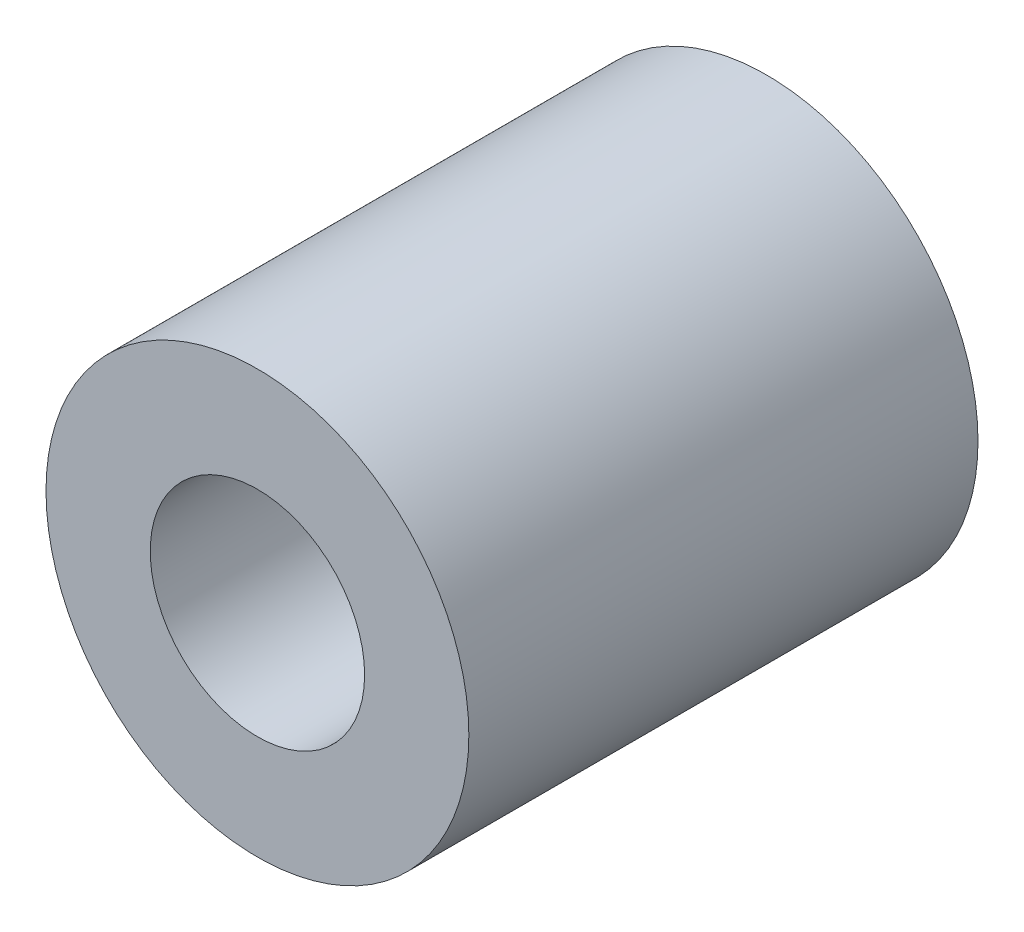
ISO-10303-21;
HEADER;
FILE_DESCRIPTION(('STEP AP214'),'2;1');
FILE_NAME('part.step','',(''),(''),'','','');
FILE_SCHEMA(('AUTOMOTIVE_DESIGN { 1 0 10303 214 1 1 1 1 }'));
ENDSEC;
DATA;
#1=APPLICATION_CONTEXT('core data for automotive mechanical design processes');
#2=APPLICATION_PROTOCOL_DEFINITION('international standard','automotive_design',2000,#1);
#3=PRODUCT_CONTEXT('',#1,'mechanical');
#4=PRODUCT('Part','Part','',(#3));
#5=PRODUCT_RELATED_PRODUCT_CATEGORY('part','',(#4));
#6=PRODUCT_DEFINITION_FORMATION('','',#4);
#7=PRODUCT_DEFINITION_CONTEXT('part definition',#1,'design');
#8=PRODUCT_DEFINITION('design','',#6,#7);
#9=PRODUCT_DEFINITION_SHAPE('','',#8);
#10=(LENGTH_UNIT() NAMED_UNIT(*) SI_UNIT(.MILLI.,.METRE.));
#11=(NAMED_UNIT(*) PLANE_ANGLE_UNIT() SI_UNIT($,.RADIAN.));
#12=(NAMED_UNIT(*) SI_UNIT($,.STERADIAN.) SOLID_ANGLE_UNIT());
#13=UNCERTAINTY_MEASURE_WITH_UNIT(LENGTH_MEASURE(1.E-05),#10,'distance_accuracy_value','');
#14=(GEOMETRIC_REPRESENTATION_CONTEXT(3) GLOBAL_UNCERTAINTY_ASSIGNED_CONTEXT((#13)) GLOBAL_UNIT_ASSIGNED_CONTEXT((#10,
#11,#12)) REPRESENTATION_CONTEXT('',''));
#15=CARTESIAN_POINT('',(0.,0.,0.));
#16=DIRECTION('',(0.,0.,1.));
#17=DIRECTION('',(1.,0.,0.));
#18=AXIS2_PLACEMENT_3D('',#15,#16,#17);
#19=CARTESIAN_POINT('',(0.,0.,19.));
#20=DIRECTION('',(0.,0.,1.));
#21=DIRECTION('',(1.,0.,0.));
#22=AXIS2_PLACEMENT_3D('',#19,#20,#21);
#23=PLANE('',#22);
#24=CARTESIAN_POINT('',(0.,0.,19.));
#25=DIRECTION('',(0.,0.,1.));
#26=DIRECTION('',(1.,0.,0.));
#27=AXIS2_PLACEMENT_3D('',#24,#25,#26);
#28=CIRCLE('',#27,7.89);
#29=CARTESIAN_POINT('',(7.89,0.,19.));
#30=VERTEX_POINT('',#29);
#31=EDGE_CURVE('E10',#30,#30,#28,.T.);
#32=ORIENTED_EDGE('',*,*,#31,.T.);
#33=EDGE_LOOP('',(#32));
#34=FACE_BOUND('',#33,.T.);
#35=CARTESIAN_POINT('',(0.,0.,19.));
#36=DIRECTION('',(0.,0.,1.));
#37=DIRECTION('',(1.,0.,0.));
#38=AXIS2_PLACEMENT_3D('',#35,#36,#37);
#39=CIRCLE('',#38,4.);
#40=CARTESIAN_POINT('',(4.,0.,19.));
#41=VERTEX_POINT('',#40);
#42=EDGE_CURVE('E48',#41,#41,#39,.T.);
#43=ORIENTED_EDGE('',*,*,#42,.F.);
#44=EDGE_LOOP('',(#43));
#45=FACE_BOUND('',#44,.T.);
#46=ADVANCED_FACE('F37',(#34,#45),#23,.T.);
#47=CARTESIAN_POINT('',(0.,0.,0.));
#48=DIRECTION('',(0.,0.,1.));
#49=DIRECTION('',(1.,0.,0.));
#50=AXIS2_PLACEMENT_3D('',#47,#48,#49);
#51=PLANE('',#50);
#52=CARTESIAN_POINT('',(0.,0.,0.));
#53=DIRECTION('',(0.,0.,1.));
#54=DIRECTION('',(1.,0.,0.));
#55=AXIS2_PLACEMENT_3D('',#52,#53,#54);
#56=CIRCLE('',#55,7.89);
#57=CARTESIAN_POINT('',(7.89,0.,0.));
#58=VERTEX_POINT('',#57);
#59=EDGE_CURVE('E41',#58,#58,#56,.T.);
#60=ORIENTED_EDGE('',*,*,#59,.F.);
#61=EDGE_LOOP('',(#60));
#62=FACE_BOUND('',#61,.T.);
#63=CARTESIAN_POINT('',(0.,0.,0.));
#64=DIRECTION('',(0.,0.,1.));
#65=DIRECTION('',(1.,0.,0.));
#66=AXIS2_PLACEMENT_3D('',#63,#64,#65);
#67=CIRCLE('',#66,4.);
#68=CARTESIAN_POINT('',(4.,0.,0.));
#69=VERTEX_POINT('',#68);
#70=EDGE_CURVE('E50',#69,#69,#67,.T.);
#71=ORIENTED_EDGE('',*,*,#70,.T.);
#72=EDGE_LOOP('',(#71));
#73=FACE_BOUND('',#72,.T.);
#74=ADVANCED_FACE('F60',(#62,#73),#51,.F.);
#75=CARTESIAN_POINT('',(0.,0.,19.));
#76=DIRECTION('',(0.,0.,-1.));
#77=DIRECTION('',(-1.,0.,0.));
#78=AXIS2_PLACEMENT_3D('',#75,#76,#77);
#79=CYLINDRICAL_SURFACE('',#78,7.89);
#80=ORIENTED_EDGE('',*,*,#31,.F.);
#81=EDGE_LOOP('',(#80));
#82=FACE_BOUND('',#81,.T.);
#83=ORIENTED_EDGE('',*,*,#59,.T.);
#84=EDGE_LOOP('',(#83));
#85=FACE_BOUND('',#84,.T.);
#86=ADVANCED_FACE('F39',(#82,#85),#79,.T.);
#87=CARTESIAN_POINT('',(0.,0.,19.));
#88=DIRECTION('',(0.,0.,-1.));
#89=DIRECTION('',(-1.,0.,0.));
#90=AXIS2_PLACEMENT_3D('',#87,#88,#89);
#91=CYLINDRICAL_SURFACE('',#90,4.);
#92=ORIENTED_EDGE('',*,*,#42,.T.);
#93=EDGE_LOOP('',(#92));
#94=FACE_BOUND('',#93,.T.);
#95=ORIENTED_EDGE('',*,*,#70,.F.);
#96=EDGE_LOOP('',(#95));
#97=FACE_BOUND('',#96,.T.);
#98=ADVANCED_FACE('F56',(#94,#97),#91,.F.);
#99=CLOSED_SHELL('',(#46,#74,#86,#98));
#100=MANIFOLD_SOLID_BREP('B2',#99);
#101=ADVANCED_BREP_SHAPE_REPRESENTATION('',(#18,#100),#14);
#102=SHAPE_DEFINITION_REPRESENTATION(#9,#101);
ENDSEC;
END-ISO-10303-21;
